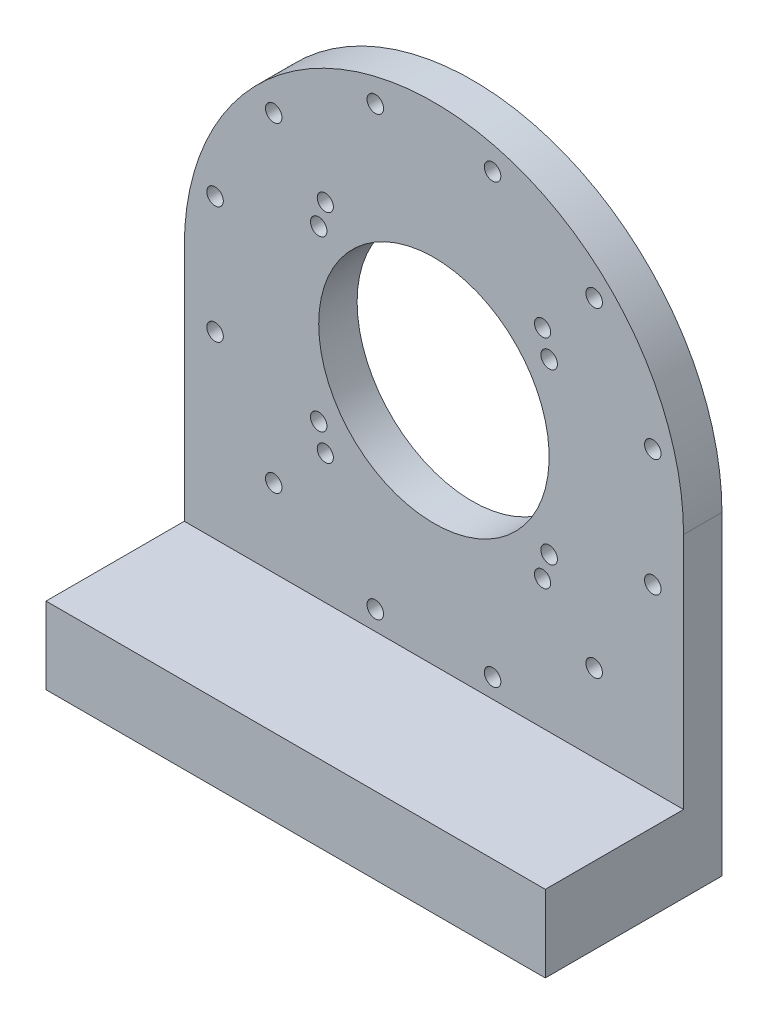
ISO-10303-21;
HEADER;
FILE_DESCRIPTION(('STEP AP214'),'2;1');
FILE_NAME('part.step','',(''),(''),'','','');
FILE_SCHEMA(('AUTOMOTIVE_DESIGN { 1 0 10303 214 1 1 1 1 }'));
ENDSEC;
DATA;
#1=APPLICATION_CONTEXT('core data for automotive mechanical design processes');
#2=APPLICATION_PROTOCOL_DEFINITION('international standard','automotive_design',2000,#1);
#3=PRODUCT_CONTEXT('',#1,'mechanical');
#4=PRODUCT('Part','Part','',(#3));
#5=PRODUCT_RELATED_PRODUCT_CATEGORY('part','',(#4));
#6=PRODUCT_DEFINITION_FORMATION('','',#4);
#7=PRODUCT_DEFINITION_CONTEXT('part definition',#1,'design');
#8=PRODUCT_DEFINITION('design','',#6,#7);
#9=PRODUCT_DEFINITION_SHAPE('','',#8);
#10=(LENGTH_UNIT() NAMED_UNIT(*) SI_UNIT(.MILLI.,.METRE.));
#11=(NAMED_UNIT(*) PLANE_ANGLE_UNIT() SI_UNIT($,.RADIAN.));
#12=(NAMED_UNIT(*) SI_UNIT($,.STERADIAN.) SOLID_ANGLE_UNIT());
#13=UNCERTAINTY_MEASURE_WITH_UNIT(LENGTH_MEASURE(1.E-05),#10,'distance_accuracy_value','');
#14=(GEOMETRIC_REPRESENTATION_CONTEXT(3) GLOBAL_UNCERTAINTY_ASSIGNED_CONTEXT((#13)) GLOBAL_UNIT_ASSIGNED_CONTEXT((#10,
#11,#12)) REPRESENTATION_CONTEXT('',''));
#15=CARTESIAN_POINT('',(0.,0.,0.));
#16=DIRECTION('',(0.,0.,1.));
#17=DIRECTION('',(1.,0.,0.));
#18=AXIS2_PLACEMENT_3D('',#15,#16,#17);
#19=CARTESIAN_POINT('',(0.,0.,-97.507071392975));
#20=DIRECTION('',(0.,0.,-1.));
#21=DIRECTION('',(-1.,0.,0.));
#22=AXIS2_PLACEMENT_3D('',#19,#20,#21);
#23=PLANE('',#22);
#24=CARTESIAN_POINT('',(119.072792821185,25.2587083204985,-97.507071392975));
#25=DIRECTION('',(0.,0.,-1.));
#26=DIRECTION('',(-1.,0.,0.));
#27=AXIS2_PLACEMENT_3D('',#24,#25,#26);
#28=CIRCLE('',#27,2.15);
#29=CARTESIAN_POINT('',(116.922792821185,25.2587083204985,-97.507071392975));
#30=VERTEX_POINT('',#29);
#31=EDGE_CURVE('E433',#30,#30,#28,.T.);
#32=ORIENTED_EDGE('',*,*,#31,.T.);
#33=EDGE_LOOP('',(#32));
#34=FACE_BOUND('',#33,.T.);
#35=CARTESIAN_POINT('',(59.0727928211845,25.2587083204985,-97.507071392975));
#36=DIRECTION('',(0.,0.,-1.));
#37=DIRECTION('',(-1.,0.,0.));
#38=AXIS2_PLACEMENT_3D('',#35,#36,#37);
#39=CIRCLE('',#38,2.15);
#40=CARTESIAN_POINT('',(56.9227928211845,25.2587083204985,-97.507071392975));
#41=VERTEX_POINT('',#40);
#42=EDGE_CURVE('E435',#41,#41,#39,.T.);
#43=ORIENTED_EDGE('',*,*,#42,.T.);
#44=EDGE_LOOP('',(#43));
#45=FACE_BOUND('',#44,.T.);
#46=CARTESIAN_POINT('',(59.0727928211845,69.2587083204985,-97.507071392975));
#47=DIRECTION('',(0.,0.,-1.));
#48=DIRECTION('',(-1.,0.,0.));
#49=AXIS2_PLACEMENT_3D('',#46,#47,#48);
#50=CIRCLE('',#49,2.15);
#51=CARTESIAN_POINT('',(56.9227928211845,69.2587083204985,-97.507071392975));
#52=VERTEX_POINT('',#51);
#53=EDGE_CURVE('E441',#52,#52,#50,.T.);
#54=ORIENTED_EDGE('',*,*,#53,.T.);
#55=EDGE_LOOP('',(#54));
#56=FACE_BOUND('',#55,.T.);
#57=CARTESIAN_POINT('',(119.072792821185,69.2587083204985,-97.507071392975));
#58=DIRECTION('',(0.,0.,-1.));
#59=DIRECTION('',(-1.,0.,0.));
#60=AXIS2_PLACEMENT_3D('',#57,#58,#59);
#61=CIRCLE('',#60,2.15);
#62=CARTESIAN_POINT('',(116.922792821185,69.2587083204985,-97.507071392975));
#63=VERTEX_POINT('',#62);
#64=EDGE_CURVE('E615',#63,#63,#61,.T.);
#65=ORIENTED_EDGE('',*,*,#64,.T.);
#66=EDGE_LOOP('',(#65));
#67=FACE_BOUND('',#66,.T.);
#68=CARTESIAN_POINT('',(47.3534927311799,88.9780084105045,-97.507071392975));
#69=DIRECTION('',(0.,0.,-1.));
#70=DIRECTION('',(-1.,0.,0.));
#71=AXIS2_PLACEMENT_3D('',#68,#69,#70);
#72=CIRCLE('',#71,2.15);
#73=CARTESIAN_POINT('',(45.2034927311799,88.9780084105045,-97.507071392975));
#74=VERTEX_POINT('',#73);
#75=EDGE_CURVE('E510',#74,#74,#72,.T.);
#76=ORIENTED_EDGE('',*,*,#75,.T.);
#77=EDGE_LOOP('',(#76));
#78=FACE_BOUND('',#77,.T.);
#79=CARTESIAN_POINT('',(32.0831690701311,62.5290319815478,-97.507071392975));
#80=DIRECTION('',(0.,0.,-1.));
#81=DIRECTION('',(-1.,0.,0.));
#82=AXIS2_PLACEMENT_3D('',#79,#80,#81);
#83=CIRCLE('',#82,2.15);
#84=CARTESIAN_POINT('',(29.9331690701311,62.5290319815478,-97.507071392975));
#85=VERTEX_POINT('',#84);
#86=EDGE_CURVE('E507',#85,#85,#83,.T.);
#87=ORIENTED_EDGE('',*,*,#86,.T.);
#88=EDGE_LOOP('',(#87));
#89=FACE_BOUND('',#88,.T.);
#90=CARTESIAN_POINT('',(32.0831690701306,31.9883846594511,-97.507071392975));
#91=DIRECTION('',(0.,0.,-1.));
#92=DIRECTION('',(-1.,0.,0.));
#93=AXIS2_PLACEMENT_3D('',#90,#91,#92);
#94=CIRCLE('',#93,2.15);
#95=CARTESIAN_POINT('',(29.9331690701306,31.9883846594511,-97.507071392975));
#96=VERTEX_POINT('',#95);
#97=EDGE_CURVE('E504',#96,#96,#94,.T.);
#98=ORIENTED_EDGE('',*,*,#97,.T.);
#99=EDGE_LOOP('',(#98));
#100=FACE_BOUND('',#99,.T.);
#101=CARTESIAN_POINT('',(47.3534927311785,5.53940823049389,-97.507071392975));
#102=DIRECTION('',(0.,0.,-1.));
#103=DIRECTION('',(-1.,0.,0.));
#104=AXIS2_PLACEMENT_3D('',#101,#102,#103);
#105=CIRCLE('',#104,2.15);
#106=CARTESIAN_POINT('',(45.2034927311785,5.53940823049389,-97.507071392975));
#107=VERTEX_POINT('',#106);
#108=EDGE_CURVE('E501',#107,#107,#105,.T.);
#109=ORIENTED_EDGE('',*,*,#108,.T.);
#110=EDGE_LOOP('',(#109));
#111=FACE_BOUND('',#110,.T.);
#112=CARTESIAN_POINT('',(73.8024691601352,-9.73091543055491,-97.507071392975));
#113=DIRECTION('',(0.,0.,-1.));
#114=DIRECTION('',(-1.,0.,0.));
#115=AXIS2_PLACEMENT_3D('',#112,#113,#114);
#116=CIRCLE('',#115,2.15);
#117=CARTESIAN_POINT('',(71.6524691601352,-9.73091543055491,-97.507071392975));
#118=VERTEX_POINT('',#117);
#119=EDGE_CURVE('E498',#118,#118,#116,.T.);
#120=ORIENTED_EDGE('',*,*,#119,.T.);
#121=EDGE_LOOP('',(#120));
#122=FACE_BOUND('',#121,.T.);
#123=CARTESIAN_POINT('',(104.343116482232,-9.73091543055543,-97.507071392975));
#124=DIRECTION('',(0.,0.,-1.));
#125=DIRECTION('',(-1.,0.,0.));
#126=AXIS2_PLACEMENT_3D('',#123,#124,#125);
#127=CIRCLE('',#126,2.15);
#128=CARTESIAN_POINT('',(102.193116482232,-9.73091543055543,-97.507071392975));
#129=VERTEX_POINT('',#128);
#130=EDGE_CURVE('E495',#129,#129,#127,.T.);
#131=ORIENTED_EDGE('',*,*,#130,.T.);
#132=EDGE_LOOP('',(#131));
#133=FACE_BOUND('',#132,.T.);
#134=CARTESIAN_POINT('',(130.792092911189,5.53940823049248,-97.507071392975));
#135=DIRECTION('',(0.,0.,-1.));
#136=DIRECTION('',(-1.,0.,0.));
#137=AXIS2_PLACEMENT_3D('',#134,#135,#136);
#138=CIRCLE('',#137,2.15000000000002);
#139=CARTESIAN_POINT('',(128.642092911189,5.53940823049248,-97.507071392975));
#140=VERTEX_POINT('',#139);
#141=EDGE_CURVE('E492',#140,#140,#138,.T.);
#142=ORIENTED_EDGE('',*,*,#141,.T.);
#143=EDGE_LOOP('',(#142));
#144=FACE_BOUND('',#143,.T.);
#145=CARTESIAN_POINT('',(146.062416572238,31.9883846594491,-97.507071392975));
#146=DIRECTION('',(0.,0.,-1.));
#147=DIRECTION('',(-1.,0.,0.));
#148=AXIS2_PLACEMENT_3D('',#145,#146,#147);
#149=CIRCLE('',#148,2.15000000000002);
#150=CARTESIAN_POINT('',(143.912416572238,31.9883846594491,-97.507071392975));
#151=VERTEX_POINT('',#150);
#152=EDGE_CURVE('E489',#151,#151,#149,.T.);
#153=ORIENTED_EDGE('',*,*,#152,.T.);
#154=EDGE_LOOP('',(#153));
#155=FACE_BOUND('',#154,.T.);
#156=CARTESIAN_POINT('',(146.062416572238,62.5290319815459,-97.507071392975));
#157=DIRECTION('',(0.,0.,-1.));
#158=DIRECTION('',(-1.,0.,0.));
#159=AXIS2_PLACEMENT_3D('',#156,#157,#158);
#160=CIRCLE('',#159,2.15000000000001);
#161=CARTESIAN_POINT('',(143.912416572238,62.5290319815459,-97.507071392975));
#162=VERTEX_POINT('',#161);
#163=EDGE_CURVE('E486',#162,#162,#160,.T.);
#164=ORIENTED_EDGE('',*,*,#163,.T.);
#165=EDGE_LOOP('',(#164));
#166=FACE_BOUND('',#165,.T.);
#167=CARTESIAN_POINT('',(130.792092911191,88.9780084105031,-97.507071392975));
#168=DIRECTION('',(0.,0.,-1.));
#169=DIRECTION('',(-1.,0.,0.));
#170=AXIS2_PLACEMENT_3D('',#167,#168,#169);
#171=CIRCLE('',#170,2.15000000000001);
#172=CARTESIAN_POINT('',(128.642092911191,88.9780084105031,-97.507071392975));
#173=VERTEX_POINT('',#172);
#174=EDGE_CURVE('E483',#173,#173,#171,.T.);
#175=ORIENTED_EDGE('',*,*,#174,.T.);
#176=EDGE_LOOP('',(#175));
#177=FACE_BOUND('',#176,.T.);
#178=CARTESIAN_POINT('',(104.343116482234,104.248332071552,-97.507071392975));
#179=DIRECTION('',(0.,0.,-1.));
#180=DIRECTION('',(-1.,0.,0.));
#181=AXIS2_PLACEMENT_3D('',#178,#179,#180);
#182=CIRCLE('',#181,2.15);
#183=CARTESIAN_POINT('',(102.193116482234,104.248332071552,-97.507071392975));
#184=VERTEX_POINT('',#183);
#185=EDGE_CURVE('E480',#184,#184,#182,.T.);
#186=ORIENTED_EDGE('',*,*,#185,.T.);
#187=EDGE_LOOP('',(#186));
#188=FACE_BOUND('',#187,.T.);
#189=CARTESIAN_POINT('',(73.8024691601371,104.248332071552,-97.507071392975));
#190=DIRECTION('',(0.,0.,-1.));
#191=DIRECTION('',(-1.,0.,0.));
#192=AXIS2_PLACEMENT_3D('',#189,#190,#191);
#193=CIRCLE('',#192,2.15);
#194=CARTESIAN_POINT('',(71.6524691601371,104.248332071552,-97.507071392975));
#195=VERTEX_POINT('',#194);
#196=EDGE_CURVE('E477',#195,#195,#193,.T.);
#197=ORIENTED_EDGE('',*,*,#196,.T.);
#198=EDGE_LOOP('',(#197));
#199=FACE_BOUND('',#198,.T.);
#200=CARTESIAN_POINT('',(89.0727928211845,47.2587083204985,-97.507071392975));
#201=DIRECTION('',(0.,0.,-1.));
#202=DIRECTION('',(-1.,0.,0.));
#203=AXIS2_PLACEMENT_3D('',#200,#201,#202);
#204=CIRCLE('',#203,30.);
#205=CARTESIAN_POINT('',(59.0727928211845,47.2587083204985,-97.507071392975));
#206=VERTEX_POINT('',#205);
#207=EDGE_CURVE('E127',#206,#206,#204,.T.);
#208=ORIENTED_EDGE('',*,*,#207,.T.);
#209=EDGE_LOOP('',(#208));
#210=FACE_BOUND('',#209,.T.);
#211=CARTESIAN_POINT('',(60.788521573722,18.9744370730372,-97.507071392975));
#212=DIRECTION('',(0.,0.,-1.));
#213=DIRECTION('',(-1.,0.,0.));
#214=AXIS2_PLACEMENT_3D('',#211,#212,#213);
#215=CIRCLE('',#214,2.1);
#216=CARTESIAN_POINT('',(58.688521573722,18.9744370730372,-97.507071392975));
#217=VERTEX_POINT('',#216);
#218=EDGE_CURVE('E139',#217,#217,#215,.F.);
#219=ORIENTED_EDGE('',*,*,#218,.F.);
#220=EDGE_LOOP('',(#219));
#221=FACE_BOUND('',#220,.T.);
#222=CARTESIAN_POINT('',(117.357064068646,75.5429795679604,-97.507071392975));
#223=DIRECTION('',(0.,0.,-1.));
#224=DIRECTION('',(-1.,0.,0.));
#225=AXIS2_PLACEMENT_3D('',#222,#223,#224);
#226=CIRCLE('',#225,2.1);
#227=CARTESIAN_POINT('',(115.257064068646,75.5429795679604,-97.507071392975));
#228=VERTEX_POINT('',#227);
#229=EDGE_CURVE('E166',#228,#228,#226,.F.);
#230=ORIENTED_EDGE('',*,*,#229,.F.);
#231=EDGE_LOOP('',(#230));
#232=FACE_BOUND('',#231,.T.);
#233=CARTESIAN_POINT('',(60.7885215737225,75.5429795679611,-97.507071392975));
#234=DIRECTION('',(0.,0.,-1.));
#235=DIRECTION('',(-1.,0.,0.));
#236=AXIS2_PLACEMENT_3D('',#233,#234,#235);
#237=CIRCLE('',#236,2.1);
#238=CARTESIAN_POINT('',(58.6885215737225,75.5429795679611,-97.507071392975));
#239=VERTEX_POINT('',#238);
#240=EDGE_CURVE('E163',#239,#239,#237,.F.);
#241=ORIENTED_EDGE('',*,*,#240,.F.);
#242=EDGE_LOOP('',(#241));
#243=FACE_BOUND('',#242,.T.);
#244=CARTESIAN_POINT('',(117.357064068646,18.9744370730369,-97.507071392975));
#245=DIRECTION('',(0.,0.,-1.));
#246=DIRECTION('',(-1.,0.,0.));
#247=AXIS2_PLACEMENT_3D('',#244,#245,#246);
#248=CIRCLE('',#247,2.1);
#249=CARTESIAN_POINT('',(115.257064068646,18.9744370730369,-97.507071392975));
#250=VERTEX_POINT('',#249);
#251=EDGE_CURVE('E160',#250,#250,#248,.F.);
#252=ORIENTED_EDGE('',*,*,#251,.F.);
#253=EDGE_LOOP('',(#252));
#254=FACE_BOUND('',#253,.T.);
#255=DIRECTION('',(-1.,0.,0.));
#256=VECTOR('',#255,1.);
#257=CARTESIAN_POINT('',(0.,-14.7412916795015,-97.507071392975));
#258=LINE('',#257,#256);
#259=CARTESIAN_POINT('',(154.072792821184,-14.7412916795015,-97.507071392975));
#260=VERTEX_POINT('',#259);
#261=CARTESIAN_POINT('',(24.0727928211845,-14.7412916795015,-97.507071392975));
#262=VERTEX_POINT('',#261);
#263=EDGE_CURVE('E58',#260,#262,#258,.T.);
#264=ORIENTED_EDGE('',*,*,#263,.F.);
#265=DIRECTION('',(0.,-1.,0.));
#266=VECTOR('',#265,1.);
#267=CARTESIAN_POINT('',(154.072792821184,0.,-97.507071392975));
#268=LINE('',#267,#266);
#269=CARTESIAN_POINT('',(154.072792821185,47.2587083204985,-97.507071392975));
#270=VERTEX_POINT('',#269);
#271=EDGE_CURVE('E158',#270,#260,#268,.T.);
#272=ORIENTED_EDGE('',*,*,#271,.F.);
#273=CARTESIAN_POINT('',(89.0727928211845,47.2587083204985,-97.507071392975));
#274=DIRECTION('',(0.,0.,-1.));
#275=DIRECTION('',(-1.,0.,0.));
#276=AXIS2_PLACEMENT_3D('',#273,#274,#275);
#277=CIRCLE('',#276,65.);
#278=CARTESIAN_POINT('',(24.0727928211845,47.2587083204985,-97.507071392975));
#279=VERTEX_POINT('',#278);
#280=EDGE_CURVE('E81',#279,#270,#277,.T.);
#281=ORIENTED_EDGE('',*,*,#280,.F.);
#282=DIRECTION('',(0.,-1.,0.));
#283=VECTOR('',#282,1.);
#284=CARTESIAN_POINT('',(24.0727928211845,0.,-97.507071392975));
#285=LINE('',#284,#283);
#286=EDGE_CURVE('E134',#279,#262,#285,.T.);
#287=ORIENTED_EDGE('',*,*,#286,.T.);
#288=EDGE_LOOP('',(#264,#272,#281,#287));
#289=FACE_BOUND('',#288,.T.);
#290=ADVANCED_FACE('F43',(#34,#45,#56,#67,#78,#89,#100,#111,#122,#133,#144,#155,#166,#177,#188,
#199,#210,#221,#232,#243,#254,#289),#23,.F.);
#291=CARTESIAN_POINT('',(24.0727928211845,0.,-107.507071392975));
#292=DIRECTION('',(-1.,0.,0.));
#293=DIRECTION('',(0.,-1.,0.));
#294=AXIS2_PLACEMENT_3D('',#291,#292,#293);
#295=PLANE('',#294);
#296=ORIENTED_EDGE('',*,*,#286,.F.);
#297=DIRECTION('',(0.,0.,1.));
#298=VECTOR('',#297,1.);
#299=CARTESIAN_POINT('',(24.0727928211845,47.2587083204985,-107.507071392975));
#300=LINE('',#299,#298);
#301=CARTESIAN_POINT('',(24.0727928211845,47.2587083204985,-107.507071392975));
#302=VERTEX_POINT('',#301);
#303=EDGE_CURVE('E11',#302,#279,#300,.T.);
#304=ORIENTED_EDGE('',*,*,#303,.F.);
#305=DIRECTION('',(0.,-1.,0.));
#306=VECTOR('',#305,1.);
#307=CARTESIAN_POINT('',(24.0727928211845,0.,-107.507071392975));
#308=LINE('',#307,#306);
#309=CARTESIAN_POINT('',(24.0727928211845,-34.7412916795015,-107.507071392975));
#310=VERTEX_POINT('',#309);
#311=EDGE_CURVE('E136',#302,#310,#308,.T.);
#312=ORIENTED_EDGE('',*,*,#311,.T.);
#313=DIRECTION('',(0.,0.,1.));
#314=VECTOR('',#313,1.);
#315=CARTESIAN_POINT('',(24.0727928211845,-34.7412916795015,-107.507071392975));
#316=LINE('',#315,#314);
#317=CARTESIAN_POINT('',(24.0727928211845,-34.7412916795015,-61.507071392975));
#318=VERTEX_POINT('',#317);
#319=EDGE_CURVE('E125',#310,#318,#316,.T.);
#320=ORIENTED_EDGE('',*,*,#319,.T.);
#321=DIRECTION('',(0.,-1.,0.));
#322=VECTOR('',#321,1.);
#323=CARTESIAN_POINT('',(24.0727928211845,0.,-61.507071392975));
#324=LINE('',#323,#322);
#325=CARTESIAN_POINT('',(24.0727928211845,-14.7412916795015,-61.507071392975));
#326=VERTEX_POINT('',#325);
#327=EDGE_CURVE('E112',#326,#318,#324,.T.);
#328=ORIENTED_EDGE('',*,*,#327,.F.);
#329=DIRECTION('',(0.,0.,-1.));
#330=VECTOR('',#329,1.);
#331=CARTESIAN_POINT('',(24.0727928211845,-14.7412916795015,-61.507071392975));
#332=LINE('',#331,#330);
#333=EDGE_CURVE('E120',#326,#262,#332,.T.);
#334=ORIENTED_EDGE('',*,*,#333,.T.);
#335=EDGE_LOOP('',(#296,#304,#312,#320,#328,#334));
#336=FACE_BOUND('',#335,.T.);
#337=ADVANCED_FACE('F45',(#336),#295,.T.);
#338=CARTESIAN_POINT('',(89.0727928211845,47.2587083204985,-107.507071392975));
#339=DIRECTION('',(0.,0.,1.));
#340=DIRECTION('',(1.,0.,0.));
#341=AXIS2_PLACEMENT_3D('',#338,#339,#340);
#342=CYLINDRICAL_SURFACE('',#341,65.);
#343=ORIENTED_EDGE('',*,*,#280,.T.);
#344=DIRECTION('',(0.,0.,1.));
#345=VECTOR('',#344,1.);
#346=CARTESIAN_POINT('',(154.072792821185,47.2587083204985,-107.507071392975));
#347=LINE('',#346,#345);
#348=CARTESIAN_POINT('',(154.072792821185,47.2587083204985,-107.507071392975));
#349=VERTEX_POINT('',#348);
#350=EDGE_CURVE('E51',#349,#270,#347,.T.);
#351=ORIENTED_EDGE('',*,*,#350,.F.);
#352=CARTESIAN_POINT('',(89.0727928211845,47.2587083204985,-107.507071392975));
#353=DIRECTION('',(0.,0.,-1.));
#354=DIRECTION('',(-1.,0.,0.));
#355=AXIS2_PLACEMENT_3D('',#352,#353,#354);
#356=CIRCLE('',#355,65.);
#357=EDGE_CURVE('E138',#302,#349,#356,.T.);
#358=ORIENTED_EDGE('',*,*,#357,.F.);
#359=ORIENTED_EDGE('',*,*,#303,.T.);
#360=EDGE_LOOP('',(#343,#351,#358,#359));
#361=FACE_BOUND('',#360,.T.);
#362=ADVANCED_FACE('F185',(#361),#342,.T.);
#363=CARTESIAN_POINT('',(154.072792821184,0.,-107.507071392975));
#364=DIRECTION('',(-1.,0.,0.));
#365=DIRECTION('',(0.,-1.,0.));
#366=AXIS2_PLACEMENT_3D('',#363,#364,#365);
#367=PLANE('',#366);
#368=ORIENTED_EDGE('',*,*,#271,.T.);
#369=DIRECTION('',(0.,0.,-1.));
#370=VECTOR('',#369,1.);
#371=CARTESIAN_POINT('',(154.072792821184,-14.7412916795015,-61.507071392975));
#372=LINE('',#371,#370);
#373=CARTESIAN_POINT('',(154.072792821184,-14.7412916795015,-61.507071392975));
#374=VERTEX_POINT('',#373);
#375=EDGE_CURVE('E122',#374,#260,#372,.T.);
#376=ORIENTED_EDGE('',*,*,#375,.F.);
#377=DIRECTION('',(0.,-1.,0.));
#378=VECTOR('',#377,1.);
#379=CARTESIAN_POINT('',(154.072792821184,0.,-61.507071392975));
#380=LINE('',#379,#378);
#381=CARTESIAN_POINT('',(154.072792821184,-34.7412916795015,-61.507071392975));
#382=VERTEX_POINT('',#381);
#383=EDGE_CURVE('E115',#374,#382,#380,.T.);
#384=ORIENTED_EDGE('',*,*,#383,.T.);
#385=DIRECTION('',(0.,0.,1.));
#386=VECTOR('',#385,1.);
#387=CARTESIAN_POINT('',(154.072792821184,-34.7412916795015,-107.507071392975));
#388=LINE('',#387,#386);
#389=CARTESIAN_POINT('',(154.072792821184,-34.7412916795015,-107.507071392975));
#390=VERTEX_POINT('',#389);
#391=EDGE_CURVE('E172',#390,#382,#388,.T.);
#392=ORIENTED_EDGE('',*,*,#391,.F.);
#393=DIRECTION('',(0.,-1.,0.));
#394=VECTOR('',#393,1.);
#395=CARTESIAN_POINT('',(154.072792821184,0.,-107.507071392975));
#396=LINE('',#395,#394);
#397=EDGE_CURVE('E141',#349,#390,#396,.T.);
#398=ORIENTED_EDGE('',*,*,#397,.F.);
#399=ORIENTED_EDGE('',*,*,#350,.T.);
#400=EDGE_LOOP('',(#368,#376,#384,#392,#398,#399));
#401=FACE_BOUND('',#400,.T.);
#402=ADVANCED_FACE('F175',(#401),#367,.F.);
#403=CARTESIAN_POINT('',(117.357064068646,75.5429795679604,-107.507071392975));
#404=DIRECTION('',(0.,0.,1.));
#405=DIRECTION('',(1.,0.,0.));
#406=AXIS2_PLACEMENT_3D('',#403,#404,#405);
#407=CYLINDRICAL_SURFACE('',#406,2.1);
#408=CARTESIAN_POINT('',(117.357064068646,75.5429795679604,-107.507071392975));
#409=DIRECTION('',(0.,0.,-1.));
#410=DIRECTION('',(-1.,0.,0.));
#411=AXIS2_PLACEMENT_3D('',#408,#409,#410);
#412=CIRCLE('',#411,2.1);
#413=CARTESIAN_POINT('',(115.257064068646,75.5429795679604,-107.507071392975));
#414=VERTEX_POINT('',#413);
#415=EDGE_CURVE('E150',#414,#414,#412,.F.);
#416=ORIENTED_EDGE('',*,*,#415,.F.);
#417=EDGE_LOOP('',(#416));
#418=FACE_BOUND('',#417,.T.);
#419=ORIENTED_EDGE('',*,*,#229,.T.);
#420=EDGE_LOOP('',(#419));
#421=FACE_BOUND('',#420,.T.);
#422=ADVANCED_FACE('F197',(#418,#421),#407,.F.);
#423=CARTESIAN_POINT('',(60.7885215737225,75.5429795679611,-107.507071392975));
#424=DIRECTION('',(0.,0.,1.));
#425=DIRECTION('',(1.,0.,0.));
#426=AXIS2_PLACEMENT_3D('',#423,#424,#425);
#427=CYLINDRICAL_SURFACE('',#426,2.1);
#428=CARTESIAN_POINT('',(60.7885215737225,75.5429795679611,-107.507071392975));
#429=DIRECTION('',(0.,0.,-1.));
#430=DIRECTION('',(-1.,0.,0.));
#431=AXIS2_PLACEMENT_3D('',#428,#429,#430);
#432=CIRCLE('',#431,2.1);
#433=CARTESIAN_POINT('',(58.6885215737225,75.5429795679611,-107.507071392975));
#434=VERTEX_POINT('',#433);
#435=EDGE_CURVE('E147',#434,#434,#432,.F.);
#436=ORIENTED_EDGE('',*,*,#435,.F.);
#437=EDGE_LOOP('',(#436));
#438=FACE_BOUND('',#437,.T.);
#439=ORIENTED_EDGE('',*,*,#240,.T.);
#440=EDGE_LOOP('',(#439));
#441=FACE_BOUND('',#440,.T.);
#442=ADVANCED_FACE('F200',(#438,#441),#427,.F.);
#443=CARTESIAN_POINT('',(117.357064068646,18.9744370730369,-107.507071392975));
#444=DIRECTION('',(0.,0.,1.));
#445=DIRECTION('',(1.,0.,0.));
#446=AXIS2_PLACEMENT_3D('',#443,#444,#445);
#447=CYLINDRICAL_SURFACE('',#446,2.1);
#448=CARTESIAN_POINT('',(117.357064068646,18.9744370730369,-107.507071392975));
#449=DIRECTION('',(0.,0.,-1.));
#450=DIRECTION('',(-1.,0.,0.));
#451=AXIS2_PLACEMENT_3D('',#448,#449,#450);
#452=CIRCLE('',#451,2.1);
#453=CARTESIAN_POINT('',(115.257064068646,18.9744370730369,-107.507071392975));
#454=VERTEX_POINT('',#453);
#455=EDGE_CURVE('E144',#454,#454,#452,.F.);
#456=ORIENTED_EDGE('',*,*,#455,.F.);
#457=EDGE_LOOP('',(#456));
#458=FACE_BOUND('',#457,.T.);
#459=ORIENTED_EDGE('',*,*,#251,.T.);
#460=EDGE_LOOP('',(#459));
#461=FACE_BOUND('',#460,.T.);
#462=ADVANCED_FACE('F204',(#458,#461),#447,.F.);
#463=CARTESIAN_POINT('',(0.,-34.7412916795015,-107.507071392975));
#464=DIRECTION('',(0.,1.,0.));
#465=DIRECTION('',(0.,0.,1.));
#466=AXIS2_PLACEMENT_3D('',#463,#464,#465);
#467=PLANE('',#466);
#468=ORIENTED_EDGE('',*,*,#391,.T.);
#469=DIRECTION('',(-1.,0.,0.));
#470=VECTOR('',#469,1.);
#471=CARTESIAN_POINT('',(0.,-34.7412916795015,-61.507071392975));
#472=LINE('',#471,#470);
#473=EDGE_CURVE('E123',#382,#318,#472,.T.);
#474=ORIENTED_EDGE('',*,*,#473,.T.);
#475=ORIENTED_EDGE('',*,*,#319,.F.);
#476=DIRECTION('',(-1.,0.,0.));
#477=VECTOR('',#476,1.);
#478=CARTESIAN_POINT('',(0.,-34.7412916795015,-107.507071392975));
#479=LINE('',#478,#477);
#480=EDGE_CURVE('E67',#390,#310,#479,.T.);
#481=ORIENTED_EDGE('',*,*,#480,.F.);
#482=EDGE_LOOP('',(#468,#474,#475,#481));
#483=FACE_BOUND('',#482,.T.);
#484=ADVANCED_FACE('F195',(#483),#467,.F.);
#485=CARTESIAN_POINT('',(60.788521573722,18.9744370730372,-107.507071392975));
#486=DIRECTION('',(0.,0.,1.));
#487=DIRECTION('',(1.,0.,0.));
#488=AXIS2_PLACEMENT_3D('',#485,#486,#487);
#489=CYLINDRICAL_SURFACE('',#488,2.1);
#490=CARTESIAN_POINT('',(60.788521573722,18.9744370730372,-107.507071392975));
#491=DIRECTION('',(0.,0.,-1.));
#492=DIRECTION('',(-1.,0.,0.));
#493=AXIS2_PLACEMENT_3D('',#490,#491,#492);
#494=CIRCLE('',#493,2.1);
#495=CARTESIAN_POINT('',(58.688521573722,18.9744370730372,-107.507071392975));
#496=VERTEX_POINT('',#495);
#497=EDGE_CURVE('E153',#496,#496,#494,.F.);
#498=ORIENTED_EDGE('',*,*,#497,.F.);
#499=EDGE_LOOP('',(#498));
#500=FACE_BOUND('',#499,.T.);
#501=ORIENTED_EDGE('',*,*,#218,.T.);
#502=EDGE_LOOP('',(#501));
#503=FACE_BOUND('',#502,.T.);
#504=ADVANCED_FACE('F192',(#500,#503),#489,.F.);
#505=CARTESIAN_POINT('',(0.,0.,-107.507071392975));
#506=DIRECTION('',(0.,0.,-1.));
#507=DIRECTION('',(-1.,0.,0.));
#508=AXIS2_PLACEMENT_3D('',#505,#506,#507);
#509=PLANE('',#508);
#510=CARTESIAN_POINT('',(119.072792821185,25.2587083204985,-107.507071392975));
#511=DIRECTION('',(0.,0.,-1.));
#512=DIRECTION('',(-1.,0.,0.));
#513=AXIS2_PLACEMENT_3D('',#510,#511,#512);
#514=CIRCLE('',#513,2.15);
#515=CARTESIAN_POINT('',(116.922792821185,25.2587083204985,-107.507071392975));
#516=VERTEX_POINT('',#515);
#517=EDGE_CURVE('E431',#516,#516,#514,.T.);
#518=ORIENTED_EDGE('',*,*,#517,.F.);
#519=EDGE_LOOP('',(#518));
#520=FACE_BOUND('',#519,.T.);
#521=CARTESIAN_POINT('',(59.0727928211845,25.2587083204985,-107.507071392975));
#522=DIRECTION('',(0.,0.,-1.));
#523=DIRECTION('',(-1.,0.,0.));
#524=AXIS2_PLACEMENT_3D('',#521,#522,#523);
#525=CIRCLE('',#524,2.15);
#526=CARTESIAN_POINT('',(56.9227928211845,25.2587083204985,-107.507071392975));
#527=VERTEX_POINT('',#526);
#528=EDGE_CURVE('E547',#527,#527,#525,.T.);
#529=ORIENTED_EDGE('',*,*,#528,.F.);
#530=EDGE_LOOP('',(#529));
#531=FACE_BOUND('',#530,.T.);
#532=CARTESIAN_POINT('',(59.0727928211845,69.2587083204985,-107.507071392975));
#533=DIRECTION('',(0.,0.,-1.));
#534=DIRECTION('',(-1.,0.,0.));
#535=AXIS2_PLACEMENT_3D('',#532,#533,#534);
#536=CIRCLE('',#535,2.15);
#537=CARTESIAN_POINT('',(56.9227928211845,69.2587083204985,-107.507071392975));
#538=VERTEX_POINT('',#537);
#539=EDGE_CURVE('E551',#538,#538,#536,.T.);
#540=ORIENTED_EDGE('',*,*,#539,.F.);
#541=EDGE_LOOP('',(#540));
#542=FACE_BOUND('',#541,.T.);
#543=CARTESIAN_POINT('',(119.072792821185,69.2587083204985,-107.507071392975));
#544=DIRECTION('',(0.,0.,-1.));
#545=DIRECTION('',(-1.,0.,0.));
#546=AXIS2_PLACEMENT_3D('',#543,#544,#545);
#547=CIRCLE('',#546,2.15);
#548=CARTESIAN_POINT('',(116.922792821185,69.2587083204985,-107.507071392975));
#549=VERTEX_POINT('',#548);
#550=EDGE_CURVE('E555',#549,#549,#547,.T.);
#551=ORIENTED_EDGE('',*,*,#550,.F.);
#552=EDGE_LOOP('',(#551));
#553=FACE_BOUND('',#552,.T.);
#554=CARTESIAN_POINT('',(47.3534927311799,88.9780084105045,-107.507071392975));
#555=DIRECTION('',(0.,0.,-1.));
#556=DIRECTION('',(-1.,0.,0.));
#557=AXIS2_PLACEMENT_3D('',#554,#555,#556);
#558=CIRCLE('',#557,2.15);
#559=CARTESIAN_POINT('',(45.2034927311799,88.9780084105045,-107.507071392975));
#560=VERTEX_POINT('',#559);
#561=EDGE_CURVE('E451',#560,#560,#558,.T.);
#562=ORIENTED_EDGE('',*,*,#561,.F.);
#563=EDGE_LOOP('',(#562));
#564=FACE_BOUND('',#563,.T.);
#565=CARTESIAN_POINT('',(32.0831690701311,62.5290319815478,-107.507071392975));
#566=DIRECTION('',(0.,0.,-1.));
#567=DIRECTION('',(-1.,0.,0.));
#568=AXIS2_PLACEMENT_3D('',#565,#566,#567);
#569=CIRCLE('',#568,2.15);
#570=CARTESIAN_POINT('',(29.9331690701311,62.5290319815478,-107.507071392975));
#571=VERTEX_POINT('',#570);
#572=EDGE_CURVE('E455',#571,#571,#569,.T.);
#573=ORIENTED_EDGE('',*,*,#572,.F.);
#574=EDGE_LOOP('',(#573));
#575=FACE_BOUND('',#574,.T.);
#576=CARTESIAN_POINT('',(32.0831690701306,31.9883846594511,-107.507071392975));
#577=DIRECTION('',(0.,0.,-1.));
#578=DIRECTION('',(-1.,0.,0.));
#579=AXIS2_PLACEMENT_3D('',#576,#577,#578);
#580=CIRCLE('',#579,2.15);
#581=CARTESIAN_POINT('',(29.9331690701306,31.9883846594511,-107.507071392975));
#582=VERTEX_POINT('',#581);
#583=EDGE_CURVE('E458',#582,#582,#580,.T.);
#584=ORIENTED_EDGE('',*,*,#583,.F.);
#585=EDGE_LOOP('',(#584));
#586=FACE_BOUND('',#585,.T.);
#587=CARTESIAN_POINT('',(47.3534927311785,5.53940823049389,-107.507071392975));
#588=DIRECTION('',(0.,0.,-1.));
#589=DIRECTION('',(-1.,0.,0.));
#590=AXIS2_PLACEMENT_3D('',#587,#588,#589);
#591=CIRCLE('',#590,2.15);
#592=CARTESIAN_POINT('',(45.2034927311785,5.53940823049389,-107.507071392975));
#593=VERTEX_POINT('',#592);
#594=EDGE_CURVE('E461',#593,#593,#591,.T.);
#595=ORIENTED_EDGE('',*,*,#594,.F.);
#596=EDGE_LOOP('',(#595));
#597=FACE_BOUND('',#596,.T.);
#598=CARTESIAN_POINT('',(73.8024691601352,-9.73091543055491,-107.507071392975));
#599=DIRECTION('',(0.,0.,-1.));
#600=DIRECTION('',(-1.,0.,0.));
#601=AXIS2_PLACEMENT_3D('',#598,#599,#600);
#602=CIRCLE('',#601,2.15);
#603=CARTESIAN_POINT('',(71.6524691601352,-9.73091543055491,-107.507071392975));
#604=VERTEX_POINT('',#603);
#605=EDGE_CURVE('E464',#604,#604,#602,.T.);
#606=ORIENTED_EDGE('',*,*,#605,.F.);
#607=EDGE_LOOP('',(#606));
#608=FACE_BOUND('',#607,.T.);
#609=CARTESIAN_POINT('',(104.343116482232,-9.73091543055543,-107.507071392975));
#610=DIRECTION('',(0.,0.,-1.));
#611=DIRECTION('',(-1.,0.,0.));
#612=AXIS2_PLACEMENT_3D('',#609,#610,#611);
#613=CIRCLE('',#612,2.15);
#614=CARTESIAN_POINT('',(102.193116482232,-9.73091543055543,-107.507071392975));
#615=VERTEX_POINT('',#614);
#616=EDGE_CURVE('E467',#615,#615,#613,.T.);
#617=ORIENTED_EDGE('',*,*,#616,.F.);
#618=EDGE_LOOP('',(#617));
#619=FACE_BOUND('',#618,.T.);
#620=CARTESIAN_POINT('',(130.792092911189,5.53940823049248,-107.507071392975));
#621=DIRECTION('',(0.,0.,-1.));
#622=DIRECTION('',(-1.,0.,0.));
#623=AXIS2_PLACEMENT_3D('',#620,#621,#622);
#624=CIRCLE('',#623,2.15000000000002);
#625=CARTESIAN_POINT('',(128.642092911189,5.53940823049248,-107.507071392975));
#626=VERTEX_POINT('',#625);
#627=EDGE_CURVE('E470',#626,#626,#624,.T.);
#628=ORIENTED_EDGE('',*,*,#627,.F.);
#629=EDGE_LOOP('',(#628));
#630=FACE_BOUND('',#629,.T.);
#631=CARTESIAN_POINT('',(146.062416572238,31.9883846594491,-107.507071392975));
#632=DIRECTION('',(0.,0.,-1.));
#633=DIRECTION('',(-1.,0.,0.));
#634=AXIS2_PLACEMENT_3D('',#631,#632,#633);
#635=CIRCLE('',#634,2.15000000000002);
#636=CARTESIAN_POINT('',(143.912416572238,31.9883846594491,-107.507071392975));
#637=VERTEX_POINT('',#636);
#638=EDGE_CURVE('E448',#637,#637,#635,.T.);
#639=ORIENTED_EDGE('',*,*,#638,.F.);
#640=EDGE_LOOP('',(#639));
#641=FACE_BOUND('',#640,.T.);
#642=CARTESIAN_POINT('',(146.062416572238,62.5290319815459,-107.507071392975));
#643=DIRECTION('',(0.,0.,-1.));
#644=DIRECTION('',(-1.,0.,0.));
#645=AXIS2_PLACEMENT_3D('',#642,#643,#644);
#646=CIRCLE('',#645,2.15000000000001);
#647=CARTESIAN_POINT('',(143.912416572238,62.5290319815459,-107.507071392975));
#648=VERTEX_POINT('',#647);
#649=EDGE_CURVE('E445',#648,#648,#646,.T.);
#650=ORIENTED_EDGE('',*,*,#649,.F.);
#651=EDGE_LOOP('',(#650));
#652=FACE_BOUND('',#651,.T.);
#653=CARTESIAN_POINT('',(130.792092911191,88.9780084105031,-107.507071392975));
#654=DIRECTION('',(0.,0.,-1.));
#655=DIRECTION('',(-1.,0.,0.));
#656=AXIS2_PLACEMENT_3D('',#653,#654,#655);
#657=CIRCLE('',#656,2.15000000000001);
#658=CARTESIAN_POINT('',(128.642092911191,88.9780084105031,-107.507071392975));
#659=VERTEX_POINT('',#658);
#660=EDGE_CURVE('E438',#659,#659,#657,.T.);
#661=ORIENTED_EDGE('',*,*,#660,.F.);
#662=EDGE_LOOP('',(#661));
#663=FACE_BOUND('',#662,.T.);
#664=CARTESIAN_POINT('',(104.343116482234,104.248332071552,-107.507071392975));
#665=DIRECTION('',(0.,0.,-1.));
#666=DIRECTION('',(-1.,0.,0.));
#667=AXIS2_PLACEMENT_3D('',#664,#665,#666);
#668=CIRCLE('',#667,2.15);
#669=CARTESIAN_POINT('',(102.193116482234,104.248332071552,-107.507071392975));
#670=VERTEX_POINT('',#669);
#671=EDGE_CURVE('E434',#670,#670,#668,.T.);
#672=ORIENTED_EDGE('',*,*,#671,.F.);
#673=EDGE_LOOP('',(#672));
#674=FACE_BOUND('',#673,.T.);
#675=CARTESIAN_POINT('',(73.8024691601371,104.248332071552,-107.507071392975));
#676=DIRECTION('',(0.,0.,-1.));
#677=DIRECTION('',(-1.,0.,0.));
#678=AXIS2_PLACEMENT_3D('',#675,#676,#677);
#679=CIRCLE('',#678,2.15);
#680=CARTESIAN_POINT('',(71.6524691601371,104.248332071552,-107.507071392975));
#681=VERTEX_POINT('',#680);
#682=EDGE_CURVE('E454',#681,#681,#679,.T.);
#683=ORIENTED_EDGE('',*,*,#682,.F.);
#684=EDGE_LOOP('',(#683));
#685=FACE_BOUND('',#684,.T.);
#686=CARTESIAN_POINT('',(89.0727928211845,47.2587083204985,-107.507071392975));
#687=DIRECTION('',(0.,0.,-1.));
#688=DIRECTION('',(-1.,0.,0.));
#689=AXIS2_PLACEMENT_3D('',#686,#687,#688);
#690=CIRCLE('',#689,30.);
#691=CARTESIAN_POINT('',(59.0727928211845,47.2587083204985,-107.507071392975));
#692=VERTEX_POINT('',#691);
#693=EDGE_CURVE('E512',#692,#692,#690,.T.);
#694=ORIENTED_EDGE('',*,*,#693,.F.);
#695=EDGE_LOOP('',(#694));
#696=FACE_BOUND('',#695,.T.);
#697=ORIENTED_EDGE('',*,*,#311,.F.);
#698=ORIENTED_EDGE('',*,*,#357,.T.);
#699=ORIENTED_EDGE('',*,*,#397,.T.);
#700=ORIENTED_EDGE('',*,*,#480,.T.);
#701=EDGE_LOOP('',(#697,#698,#699,#700));
#702=FACE_BOUND('',#701,.T.);
#703=ORIENTED_EDGE('',*,*,#455,.T.);
#704=EDGE_LOOP('',(#703));
#705=FACE_BOUND('',#704,.T.);
#706=ORIENTED_EDGE('',*,*,#435,.T.);
#707=EDGE_LOOP('',(#706));
#708=FACE_BOUND('',#707,.T.);
#709=ORIENTED_EDGE('',*,*,#415,.T.);
#710=EDGE_LOOP('',(#709));
#711=FACE_BOUND('',#710,.T.);
#712=ORIENTED_EDGE('',*,*,#497,.T.);
#713=EDGE_LOOP('',(#712));
#714=FACE_BOUND('',#713,.T.);
#715=ADVANCED_FACE('F190',(#520,#531,#542,#553,#564,#575,#586,#597,#608,#619,#630,#641,#652,
#663,#674,#685,#696,#702,#705,#708,#711,#714),#509,.T.);
#716=CARTESIAN_POINT('',(0.,-14.7412916795015,-61.507071392975));
#717=DIRECTION('',(0.,-1.,0.));
#718=DIRECTION('',(0.,0.,-1.));
#719=AXIS2_PLACEMENT_3D('',#716,#717,#718);
#720=PLANE('',#719);
#721=ORIENTED_EDGE('',*,*,#263,.T.);
#722=ORIENTED_EDGE('',*,*,#333,.F.);
#723=DIRECTION('',(-1.,0.,0.));
#724=VECTOR('',#723,1.);
#725=CARTESIAN_POINT('',(0.,-14.7412916795015,-61.507071392975));
#726=LINE('',#725,#724);
#727=EDGE_CURVE('E107',#374,#326,#726,.T.);
#728=ORIENTED_EDGE('',*,*,#727,.F.);
#729=ORIENTED_EDGE('',*,*,#375,.T.);
#730=EDGE_LOOP('',(#721,#722,#728,#729));
#731=FACE_BOUND('',#730,.T.);
#732=ADVANCED_FACE('F121',(#731),#720,.F.);
#733=CARTESIAN_POINT('',(0.,0.,-61.507071392975));
#734=DIRECTION('',(0.,0.,-1.));
#735=DIRECTION('',(-1.,0.,0.));
#736=AXIS2_PLACEMENT_3D('',#733,#734,#735);
#737=PLANE('',#736);
#738=ORIENTED_EDGE('',*,*,#327,.T.);
#739=ORIENTED_EDGE('',*,*,#473,.F.);
#740=ORIENTED_EDGE('',*,*,#383,.F.);
#741=ORIENTED_EDGE('',*,*,#727,.T.);
#742=EDGE_LOOP('',(#738,#739,#740,#741));
#743=FACE_BOUND('',#742,.T.);
#744=ADVANCED_FACE('F109',(#743),#737,.F.);
#745=CARTESIAN_POINT('',(89.0727928211845,47.2587083204985,-71.507071392975));
#746=DIRECTION('',(0.,0.,-1.));
#747=DIRECTION('',(-1.,0.,0.));
#748=AXIS2_PLACEMENT_3D('',#745,#746,#747);
#749=CYLINDRICAL_SURFACE('',#748,30.);
#750=ORIENTED_EDGE('',*,*,#693,.T.);
#751=EDGE_LOOP('',(#750));
#752=FACE_BOUND('',#751,.T.);
#753=ORIENTED_EDGE('',*,*,#207,.F.);
#754=EDGE_LOOP('',(#753));
#755=FACE_BOUND('',#754,.T.);
#756=ADVANCED_FACE('F268',(#752,#755),#749,.F.);
#757=CARTESIAN_POINT('',(73.8024691601371,104.248332071552,-61.507071392975));
#758=DIRECTION('',(0.,0.,-1.));
#759=DIRECTION('',(-1.,0.,0.));
#760=AXIS2_PLACEMENT_3D('',#757,#758,#759);
#761=CYLINDRICAL_SURFACE('',#760,2.15);
#762=ORIENTED_EDGE('',*,*,#682,.T.);
#763=EDGE_LOOP('',(#762));
#764=FACE_BOUND('',#763,.T.);
#765=ORIENTED_EDGE('',*,*,#196,.F.);
#766=EDGE_LOOP('',(#765));
#767=FACE_BOUND('',#766,.T.);
#768=ADVANCED_FACE('F276',(#764,#767),#761,.F.);
#769=CARTESIAN_POINT('',(104.343116482234,104.248332071552,-61.507071392975));
#770=DIRECTION('',(0.,0.,-1.));
#771=DIRECTION('',(-1.,0.,0.));
#772=AXIS2_PLACEMENT_3D('',#769,#770,#771);
#773=CYLINDRICAL_SURFACE('',#772,2.15);
#774=ORIENTED_EDGE('',*,*,#671,.T.);
#775=EDGE_LOOP('',(#774));
#776=FACE_BOUND('',#775,.T.);
#777=ORIENTED_EDGE('',*,*,#185,.F.);
#778=EDGE_LOOP('',(#777));
#779=FACE_BOUND('',#778,.T.);
#780=ADVANCED_FACE('F285',(#776,#779),#773,.F.);
#781=CARTESIAN_POINT('',(130.792092911191,88.9780084105031,-61.507071392975));
#782=DIRECTION('',(0.,0.,-1.));
#783=DIRECTION('',(-1.,0.,0.));
#784=AXIS2_PLACEMENT_3D('',#781,#782,#783);
#785=CYLINDRICAL_SURFACE('',#784,2.15000000000001);
#786=ORIENTED_EDGE('',*,*,#660,.T.);
#787=EDGE_LOOP('',(#786));
#788=FACE_BOUND('',#787,.T.);
#789=ORIENTED_EDGE('',*,*,#174,.F.);
#790=EDGE_LOOP('',(#789));
#791=FACE_BOUND('',#790,.T.);
#792=ADVANCED_FACE('F294',(#788,#791),#785,.F.);
#793=CARTESIAN_POINT('',(146.062416572238,62.5290319815459,-61.507071392975));
#794=DIRECTION('',(0.,0.,-1.));
#795=DIRECTION('',(-1.,0.,0.));
#796=AXIS2_PLACEMENT_3D('',#793,#794,#795);
#797=CYLINDRICAL_SURFACE('',#796,2.15000000000001);
#798=ORIENTED_EDGE('',*,*,#649,.T.);
#799=EDGE_LOOP('',(#798));
#800=FACE_BOUND('',#799,.T.);
#801=ORIENTED_EDGE('',*,*,#163,.F.);
#802=EDGE_LOOP('',(#801));
#803=FACE_BOUND('',#802,.T.);
#804=ADVANCED_FACE('F303',(#800,#803),#797,.F.);
#805=CARTESIAN_POINT('',(146.062416572238,31.9883846594491,-61.507071392975));
#806=DIRECTION('',(0.,0.,-1.));
#807=DIRECTION('',(-1.,0.,0.));
#808=AXIS2_PLACEMENT_3D('',#805,#806,#807);
#809=CYLINDRICAL_SURFACE('',#808,2.15000000000002);
#810=ORIENTED_EDGE('',*,*,#638,.T.);
#811=EDGE_LOOP('',(#810));
#812=FACE_BOUND('',#811,.T.);
#813=ORIENTED_EDGE('',*,*,#152,.F.);
#814=EDGE_LOOP('',(#813));
#815=FACE_BOUND('',#814,.T.);
#816=ADVANCED_FACE('F312',(#812,#815),#809,.F.);
#817=CARTESIAN_POINT('',(130.792092911189,5.53940823049248,-61.507071392975));
#818=DIRECTION('',(0.,0.,-1.));
#819=DIRECTION('',(-1.,0.,0.));
#820=AXIS2_PLACEMENT_3D('',#817,#818,#819);
#821=CYLINDRICAL_SURFACE('',#820,2.15000000000002);
#822=ORIENTED_EDGE('',*,*,#627,.T.);
#823=EDGE_LOOP('',(#822));
#824=FACE_BOUND('',#823,.T.);
#825=ORIENTED_EDGE('',*,*,#141,.F.);
#826=EDGE_LOOP('',(#825));
#827=FACE_BOUND('',#826,.T.);
#828=ADVANCED_FACE('F321',(#824,#827),#821,.F.);
#829=CARTESIAN_POINT('',(104.343116482232,-9.73091543055543,-61.507071392975));
#830=DIRECTION('',(0.,0.,-1.));
#831=DIRECTION('',(-1.,0.,0.));
#832=AXIS2_PLACEMENT_3D('',#829,#830,#831);
#833=CYLINDRICAL_SURFACE('',#832,2.15);
#834=ORIENTED_EDGE('',*,*,#616,.T.);
#835=EDGE_LOOP('',(#834));
#836=FACE_BOUND('',#835,.T.);
#837=ORIENTED_EDGE('',*,*,#130,.F.);
#838=EDGE_LOOP('',(#837));
#839=FACE_BOUND('',#838,.T.);
#840=ADVANCED_FACE('F330',(#836,#839),#833,.F.);
#841=CARTESIAN_POINT('',(73.8024691601352,-9.73091543055491,-61.507071392975));
#842=DIRECTION('',(0.,0.,-1.));
#843=DIRECTION('',(-1.,0.,0.));
#844=AXIS2_PLACEMENT_3D('',#841,#842,#843);
#845=CYLINDRICAL_SURFACE('',#844,2.15);
#846=ORIENTED_EDGE('',*,*,#605,.T.);
#847=EDGE_LOOP('',(#846));
#848=FACE_BOUND('',#847,.T.);
#849=ORIENTED_EDGE('',*,*,#119,.F.);
#850=EDGE_LOOP('',(#849));
#851=FACE_BOUND('',#850,.T.);
#852=ADVANCED_FACE('F339',(#848,#851),#845,.F.);
#853=CARTESIAN_POINT('',(47.3534927311785,5.53940823049389,-61.507071392975));
#854=DIRECTION('',(0.,0.,-1.));
#855=DIRECTION('',(-1.,0.,0.));
#856=AXIS2_PLACEMENT_3D('',#853,#854,#855);
#857=CYLINDRICAL_SURFACE('',#856,2.15);
#858=ORIENTED_EDGE('',*,*,#594,.T.);
#859=EDGE_LOOP('',(#858));
#860=FACE_BOUND('',#859,.T.);
#861=ORIENTED_EDGE('',*,*,#108,.F.);
#862=EDGE_LOOP('',(#861));
#863=FACE_BOUND('',#862,.T.);
#864=ADVANCED_FACE('F348',(#860,#863),#857,.F.);
#865=CARTESIAN_POINT('',(32.0831690701306,31.9883846594511,-61.507071392975));
#866=DIRECTION('',(0.,0.,-1.));
#867=DIRECTION('',(-1.,0.,0.));
#868=AXIS2_PLACEMENT_3D('',#865,#866,#867);
#869=CYLINDRICAL_SURFACE('',#868,2.15);
#870=ORIENTED_EDGE('',*,*,#583,.T.);
#871=EDGE_LOOP('',(#870));
#872=FACE_BOUND('',#871,.T.);
#873=ORIENTED_EDGE('',*,*,#97,.F.);
#874=EDGE_LOOP('',(#873));
#875=FACE_BOUND('',#874,.T.);
#876=ADVANCED_FACE('F357',(#872,#875),#869,.F.);
#877=CARTESIAN_POINT('',(32.0831690701311,62.5290319815478,-61.507071392975));
#878=DIRECTION('',(0.,0.,-1.));
#879=DIRECTION('',(-1.,0.,0.));
#880=AXIS2_PLACEMENT_3D('',#877,#878,#879);
#881=CYLINDRICAL_SURFACE('',#880,2.15);
#882=ORIENTED_EDGE('',*,*,#572,.T.);
#883=EDGE_LOOP('',(#882));
#884=FACE_BOUND('',#883,.T.);
#885=ORIENTED_EDGE('',*,*,#86,.F.);
#886=EDGE_LOOP('',(#885));
#887=FACE_BOUND('',#886,.T.);
#888=ADVANCED_FACE('F366',(#884,#887),#881,.F.);
#889=CARTESIAN_POINT('',(47.3534927311799,88.9780084105045,-61.507071392975));
#890=DIRECTION('',(0.,0.,-1.));
#891=DIRECTION('',(-1.,0.,0.));
#892=AXIS2_PLACEMENT_3D('',#889,#890,#891);
#893=CYLINDRICAL_SURFACE('',#892,2.15);
#894=ORIENTED_EDGE('',*,*,#561,.T.);
#895=EDGE_LOOP('',(#894));
#896=FACE_BOUND('',#895,.T.);
#897=ORIENTED_EDGE('',*,*,#75,.F.);
#898=EDGE_LOOP('',(#897));
#899=FACE_BOUND('',#898,.T.);
#900=ADVANCED_FACE('F374',(#896,#899),#893,.F.);
#901=CARTESIAN_POINT('',(119.072792821185,69.2587083204985,-61.507071392975));
#902=DIRECTION('',(0.,0.,-1.));
#903=DIRECTION('',(-1.,0.,0.));
#904=AXIS2_PLACEMENT_3D('',#901,#902,#903);
#905=CYLINDRICAL_SURFACE('',#904,2.15);
#906=ORIENTED_EDGE('',*,*,#550,.T.);
#907=EDGE_LOOP('',(#906));
#908=FACE_BOUND('',#907,.T.);
#909=ORIENTED_EDGE('',*,*,#64,.F.);
#910=EDGE_LOOP('',(#909));
#911=FACE_BOUND('',#910,.T.);
#912=ADVANCED_FACE('F382',(#908,#911),#905,.F.);
#913=CARTESIAN_POINT('',(59.0727928211845,69.2587083204985,-61.507071392975));
#914=DIRECTION('',(0.,0.,-1.));
#915=DIRECTION('',(-1.,0.,0.));
#916=AXIS2_PLACEMENT_3D('',#913,#914,#915);
#917=CYLINDRICAL_SURFACE('',#916,2.15);
#918=ORIENTED_EDGE('',*,*,#539,.T.);
#919=EDGE_LOOP('',(#918));
#920=FACE_BOUND('',#919,.T.);
#921=ORIENTED_EDGE('',*,*,#53,.F.);
#922=EDGE_LOOP('',(#921));
#923=FACE_BOUND('',#922,.T.);
#924=ADVANCED_FACE('F395',(#920,#923),#917,.F.);
#925=CARTESIAN_POINT('',(59.0727928211845,25.2587083204985,-61.507071392975));
#926=DIRECTION('',(0.,0.,-1.));
#927=DIRECTION('',(-1.,0.,0.));
#928=AXIS2_PLACEMENT_3D('',#925,#926,#927);
#929=CYLINDRICAL_SURFACE('',#928,2.15);
#930=ORIENTED_EDGE('',*,*,#528,.T.);
#931=EDGE_LOOP('',(#930));
#932=FACE_BOUND('',#931,.T.);
#933=ORIENTED_EDGE('',*,*,#42,.F.);
#934=EDGE_LOOP('',(#933));
#935=FACE_BOUND('',#934,.T.);
#936=ADVANCED_FACE('F405',(#932,#935),#929,.F.);
#937=CARTESIAN_POINT('',(119.072792821185,25.2587083204985,-61.507071392975));
#938=DIRECTION('',(0.,0.,-1.));
#939=DIRECTION('',(-1.,0.,0.));
#940=AXIS2_PLACEMENT_3D('',#937,#938,#939);
#941=CYLINDRICAL_SURFACE('',#940,2.15);
#942=ORIENTED_EDGE('',*,*,#517,.T.);
#943=EDGE_LOOP('',(#942));
#944=FACE_BOUND('',#943,.T.);
#945=ORIENTED_EDGE('',*,*,#31,.F.);
#946=EDGE_LOOP('',(#945));
#947=FACE_BOUND('',#946,.T.);
#948=ADVANCED_FACE('F415',(#944,#947),#941,.F.);
#949=CLOSED_SHELL('',(#290,#337,#362,#402,#422,#442,#462,#484,#504,#715,#732,#744,#756,#768,
#780,#792,#804,#816,#828,#840,#852,#864,#876,#888,#900,#912,#924,#936,#948));
#950=MANIFOLD_SOLID_BREP('B2',#949);
#951=ADVANCED_BREP_SHAPE_REPRESENTATION('',(#18,#950),#14);
#952=SHAPE_DEFINITION_REPRESENTATION(#9,#951);
ENDSEC;
END-ISO-10303-21;
